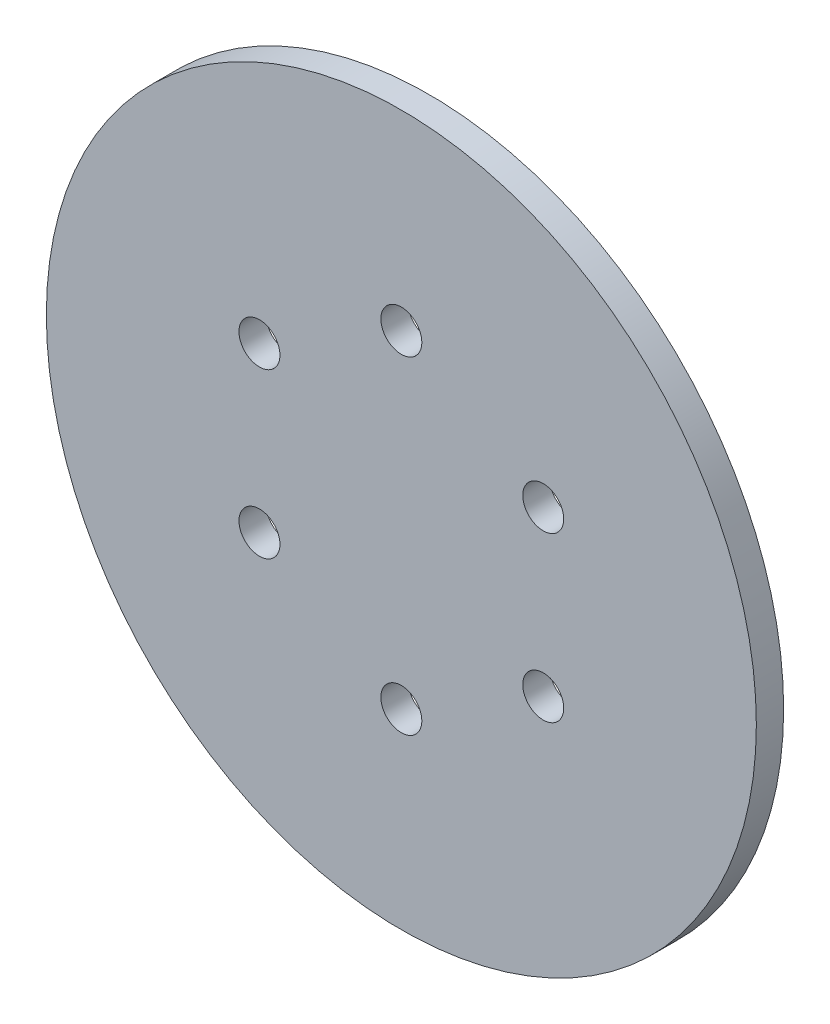
ISO-10303-21;
HEADER;
FILE_DESCRIPTION(('STEP AP214'),'2;1');
FILE_NAME('part.step','',(''),(''),'','','');
FILE_SCHEMA(('AUTOMOTIVE_DESIGN { 1 0 10303 214 1 1 1 1 }'));
ENDSEC;
DATA;
#1=APPLICATION_CONTEXT('core data for automotive mechanical design processes');
#2=APPLICATION_PROTOCOL_DEFINITION('international standard','automotive_design',2000,#1);
#3=PRODUCT_CONTEXT('',#1,'mechanical');
#4=PRODUCT('Part','Part','',(#3));
#5=PRODUCT_RELATED_PRODUCT_CATEGORY('part','',(#4));
#6=PRODUCT_DEFINITION_FORMATION('','',#4);
#7=PRODUCT_DEFINITION_CONTEXT('part definition',#1,'design');
#8=PRODUCT_DEFINITION('design','',#6,#7);
#9=PRODUCT_DEFINITION_SHAPE('','',#8);
#10=(LENGTH_UNIT() NAMED_UNIT(*) SI_UNIT(.MILLI.,.METRE.));
#11=(NAMED_UNIT(*) PLANE_ANGLE_UNIT() SI_UNIT($,.RADIAN.));
#12=(NAMED_UNIT(*) SI_UNIT($,.STERADIAN.) SOLID_ANGLE_UNIT());
#13=UNCERTAINTY_MEASURE_WITH_UNIT(LENGTH_MEASURE(1.E-05),#10,'distance_accuracy_value','');
#14=(GEOMETRIC_REPRESENTATION_CONTEXT(3) GLOBAL_UNCERTAINTY_ASSIGNED_CONTEXT((#13)) GLOBAL_UNIT_ASSIGNED_CONTEXT((#10,
#11,#12)) REPRESENTATION_CONTEXT('',''));
#15=CARTESIAN_POINT('',(0.,0.,0.));
#16=DIRECTION('',(0.,0.,1.));
#17=DIRECTION('',(1.,0.,0.));
#18=AXIS2_PLACEMENT_3D('',#15,#16,#17);
#19=CARTESIAN_POINT('',(0.,0.,3.175));
#20=DIRECTION('',(0.,0.,1.));
#21=DIRECTION('',(1.,0.,0.));
#22=AXIS2_PLACEMENT_3D('',#19,#20,#21);
#23=PLANE('',#22);
#24=CARTESIAN_POINT('',(-16.4977839420919,-9.52500000000094,3.175));
#25=DIRECTION('',(0.,0.,1.));
#26=DIRECTION('',(1.,0.,0.));
#27=AXIS2_PLACEMENT_3D('',#24,#25,#26);
#28=CIRCLE('',#27,2.381250000002);
#29=CARTESIAN_POINT('',(-14.1165339420899,-9.52500000000094,3.175));
#30=VERTEX_POINT('',#29);
#31=EDGE_CURVE('E65',#30,#30,#28,.T.);
#32=ORIENTED_EDGE('',*,*,#31,.F.);
#33=EDGE_LOOP('',(#32));
#34=FACE_BOUND('',#33,.T.);
#35=CARTESIAN_POINT('',(16.4977839420952,-9.52499999999906,3.175));
#36=DIRECTION('',(0.,0.,1.));
#37=DIRECTION('',(1.,0.,0.));
#38=AXIS2_PLACEMENT_3D('',#35,#36,#37);
#39=CIRCLE('',#38,2.38125000000136);
#40=CARTESIAN_POINT('',(18.8790339420965,-9.52499999999906,3.175));
#41=VERTEX_POINT('',#40);
#42=EDGE_CURVE('E53',#41,#41,#39,.T.);
#43=ORIENTED_EDGE('',*,*,#42,.F.);
#44=EDGE_LOOP('',(#43));
#45=FACE_BOUND('',#44,.T.);
#46=CARTESIAN_POINT('',(0.,19.05,3.175));
#47=DIRECTION('',(0.,0.,1.));
#48=DIRECTION('',(1.,0.,0.));
#49=AXIS2_PLACEMENT_3D('',#46,#47,#48);
#50=CIRCLE('',#49,2.38125);
#51=CARTESIAN_POINT('',(2.38125,19.05,3.175));
#52=VERTEX_POINT('',#51);
#53=EDGE_CURVE('E42',#52,#52,#50,.T.);
#54=ORIENTED_EDGE('',*,*,#53,.F.);
#55=EDGE_LOOP('',(#54));
#56=FACE_BOUND('',#55,.T.);
#57=CARTESIAN_POINT('',(0.,0.,3.175));
#58=DIRECTION('',(0.,0.,1.));
#59=DIRECTION('',(1.,0.,0.));
#60=AXIS2_PLACEMENT_3D('',#57,#58,#59);
#61=CIRCLE('',#60,41.275);
#62=CARTESIAN_POINT('',(41.275,0.,3.175));
#63=VERTEX_POINT('',#62);
#64=EDGE_CURVE('E10',#63,#63,#61,.T.);
#65=ORIENTED_EDGE('',*,*,#64,.T.);
#66=EDGE_LOOP('',(#65));
#67=FACE_BOUND('',#66,.T.);
#68=CARTESIAN_POINT('',(16.4977839420941,9.52500000000094,3.175));
#69=DIRECTION('',(0.,0.,1.));
#70=DIRECTION('',(1.,0.,0.));
#71=AXIS2_PLACEMENT_3D('',#68,#69,#70);
#72=CIRCLE('',#71,2.38125000000029);
#73=CARTESIAN_POINT('',(18.8790339420944,9.52500000000094,3.175));
#74=VERTEX_POINT('',#73);
#75=EDGE_CURVE('E47',#74,#74,#72,.T.);
#76=ORIENTED_EDGE('',*,*,#75,.F.);
#77=EDGE_LOOP('',(#76));
#78=FACE_BOUND('',#77,.T.);
#79=CARTESIAN_POINT('',(2.16106835429203E-12,-19.05,3.175));
#80=DIRECTION('',(0.,0.,1.));
#81=DIRECTION('',(1.,0.,0.));
#82=AXIS2_PLACEMENT_3D('',#79,#80,#81);
#83=CIRCLE('',#82,2.38125000000219);
#84=CARTESIAN_POINT('',(2.38125000000436,-19.05,3.175));
#85=VERTEX_POINT('',#84);
#86=EDGE_CURVE('E59',#85,#85,#83,.T.);
#87=ORIENTED_EDGE('',*,*,#86,.F.);
#88=EDGE_LOOP('',(#87));
#89=FACE_BOUND('',#88,.T.);
#90=CARTESIAN_POINT('',(-16.497783942093,9.52499999999905,3.175));
#91=DIRECTION('',(0.,0.,1.));
#92=DIRECTION('',(1.,0.,0.));
#93=AXIS2_PLACEMENT_3D('',#90,#91,#92);
#94=CIRCLE('',#93,2.38125000000102);
#95=CARTESIAN_POINT('',(-14.116533942092,9.52499999999905,3.175));
#96=VERTEX_POINT('',#95);
#97=EDGE_CURVE('E71',#96,#96,#94,.T.);
#98=ORIENTED_EDGE('',*,*,#97,.F.);
#99=EDGE_LOOP('',(#98));
#100=FACE_BOUND('',#99,.T.);
#101=ADVANCED_FACE('F31',(#34,#45,#56,#67,#78,#89,#100),#23,.T.);
#102=CARTESIAN_POINT('',(0.,0.,0.));
#103=DIRECTION('',(0.,0.,1.));
#104=DIRECTION('',(1.,0.,0.));
#105=AXIS2_PLACEMENT_3D('',#102,#103,#104);
#106=PLANE('',#105);
#107=CARTESIAN_POINT('',(0.,0.,0.));
#108=DIRECTION('',(0.,0.,1.));
#109=DIRECTION('',(1.,0.,0.));
#110=AXIS2_PLACEMENT_3D('',#107,#108,#109);
#111=CIRCLE('',#110,41.275);
#112=CARTESIAN_POINT('',(41.275,0.,0.));
#113=VERTEX_POINT('',#112);
#114=EDGE_CURVE('E35',#113,#113,#111,.T.);
#115=ORIENTED_EDGE('',*,*,#114,.F.);
#116=EDGE_LOOP('',(#115));
#117=FACE_BOUND('',#116,.T.);
#118=CARTESIAN_POINT('',(0.,19.05,0.));
#119=DIRECTION('',(0.,0.,1.));
#120=DIRECTION('',(1.,0.,0.));
#121=AXIS2_PLACEMENT_3D('',#118,#119,#120);
#122=CIRCLE('',#121,2.38125);
#123=CARTESIAN_POINT('',(2.38125,19.05,0.));
#124=VERTEX_POINT('',#123);
#125=EDGE_CURVE('E44',#124,#124,#122,.T.);
#126=ORIENTED_EDGE('',*,*,#125,.T.);
#127=EDGE_LOOP('',(#126));
#128=FACE_BOUND('',#127,.T.);
#129=CARTESIAN_POINT('',(16.4977839420941,9.52500000000094,0.));
#130=DIRECTION('',(0.,0.,1.));
#131=DIRECTION('',(1.,0.,0.));
#132=AXIS2_PLACEMENT_3D('',#129,#130,#131);
#133=CIRCLE('',#132,2.38125000000029);
#134=CARTESIAN_POINT('',(18.8790339420944,9.52500000000094,0.));
#135=VERTEX_POINT('',#134);
#136=EDGE_CURVE('E50',#135,#135,#133,.T.);
#137=ORIENTED_EDGE('',*,*,#136,.T.);
#138=EDGE_LOOP('',(#137));
#139=FACE_BOUND('',#138,.T.);
#140=CARTESIAN_POINT('',(16.4977839420952,-9.52499999999906,0.));
#141=DIRECTION('',(0.,0.,1.));
#142=DIRECTION('',(1.,0.,0.));
#143=AXIS2_PLACEMENT_3D('',#140,#141,#142);
#144=CIRCLE('',#143,2.38125000000136);
#145=CARTESIAN_POINT('',(18.8790339420965,-9.52499999999906,0.));
#146=VERTEX_POINT('',#145);
#147=EDGE_CURVE('E56',#146,#146,#144,.T.);
#148=ORIENTED_EDGE('',*,*,#147,.T.);
#149=EDGE_LOOP('',(#148));
#150=FACE_BOUND('',#149,.T.);
#151=CARTESIAN_POINT('',(2.16106835429203E-12,-19.05,0.));
#152=DIRECTION('',(0.,0.,1.));
#153=DIRECTION('',(1.,0.,0.));
#154=AXIS2_PLACEMENT_3D('',#151,#152,#153);
#155=CIRCLE('',#154,2.38125000000219);
#156=CARTESIAN_POINT('',(2.38125000000436,-19.05,0.));
#157=VERTEX_POINT('',#156);
#158=EDGE_CURVE('E62',#157,#157,#155,.T.);
#159=ORIENTED_EDGE('',*,*,#158,.T.);
#160=EDGE_LOOP('',(#159));
#161=FACE_BOUND('',#160,.T.);
#162=CARTESIAN_POINT('',(-16.4977839420919,-9.52500000000094,0.));
#163=DIRECTION('',(0.,0.,1.));
#164=DIRECTION('',(1.,0.,0.));
#165=AXIS2_PLACEMENT_3D('',#162,#163,#164);
#166=CIRCLE('',#165,2.381250000002);
#167=CARTESIAN_POINT('',(-14.1165339420899,-9.52500000000094,0.));
#168=VERTEX_POINT('',#167);
#169=EDGE_CURVE('E68',#168,#168,#166,.T.);
#170=ORIENTED_EDGE('',*,*,#169,.T.);
#171=EDGE_LOOP('',(#170));
#172=FACE_BOUND('',#171,.T.);
#173=CARTESIAN_POINT('',(-16.497783942093,9.52499999999905,0.));
#174=DIRECTION('',(0.,0.,1.));
#175=DIRECTION('',(1.,0.,0.));
#176=AXIS2_PLACEMENT_3D('',#173,#174,#175);
#177=CIRCLE('',#176,2.38125000000102);
#178=CARTESIAN_POINT('',(-14.116533942092,9.52499999999905,0.));
#179=VERTEX_POINT('',#178);
#180=EDGE_CURVE('E74',#179,#179,#177,.T.);
#181=ORIENTED_EDGE('',*,*,#180,.T.);
#182=EDGE_LOOP('',(#181));
#183=FACE_BOUND('',#182,.T.);
#184=ADVANCED_FACE('F84',(#117,#128,#139,#150,#161,#172,#183),#106,.F.);
#185=CARTESIAN_POINT('',(0.,0.,3.175));
#186=DIRECTION('',(0.,0.,-1.));
#187=DIRECTION('',(-1.,0.,0.));
#188=AXIS2_PLACEMENT_3D('',#185,#186,#187);
#189=CYLINDRICAL_SURFACE('',#188,41.275);
#190=ORIENTED_EDGE('',*,*,#64,.F.);
#191=EDGE_LOOP('',(#190));
#192=FACE_BOUND('',#191,.T.);
#193=ORIENTED_EDGE('',*,*,#114,.T.);
#194=EDGE_LOOP('',(#193));
#195=FACE_BOUND('',#194,.T.);
#196=ADVANCED_FACE('F33',(#192,#195),#189,.T.);
#197=CARTESIAN_POINT('',(0.,19.05,3.175));
#198=DIRECTION('',(0.,0.,-1.));
#199=DIRECTION('',(-1.,0.,0.));
#200=AXIS2_PLACEMENT_3D('',#197,#198,#199);
#201=CYLINDRICAL_SURFACE('',#200,2.38125);
#202=ORIENTED_EDGE('',*,*,#53,.T.);
#203=EDGE_LOOP('',(#202));
#204=FACE_BOUND('',#203,.T.);
#205=ORIENTED_EDGE('',*,*,#125,.F.);
#206=EDGE_LOOP('',(#205));
#207=FACE_BOUND('',#206,.T.);
#208=ADVANCED_FACE('F94',(#204,#207),#201,.F.);
#209=CARTESIAN_POINT('',(16.4977839420941,9.52500000000094,3.175));
#210=DIRECTION('',(0.,0.,-1.));
#211=DIRECTION('',(-1.,0.,0.));
#212=AXIS2_PLACEMENT_3D('',#209,#210,#211);
#213=CYLINDRICAL_SURFACE('',#212,2.38125000000029);
#214=ORIENTED_EDGE('',*,*,#75,.T.);
#215=EDGE_LOOP('',(#214));
#216=FACE_BOUND('',#215,.T.);
#217=ORIENTED_EDGE('',*,*,#136,.F.);
#218=EDGE_LOOP('',(#217));
#219=FACE_BOUND('',#218,.T.);
#220=ADVANCED_FACE('F97',(#216,#219),#213,.F.);
#221=CARTESIAN_POINT('',(16.4977839420952,-9.52499999999906,3.175));
#222=DIRECTION('',(0.,0.,-1.));
#223=DIRECTION('',(-1.,0.,0.));
#224=AXIS2_PLACEMENT_3D('',#221,#222,#223);
#225=CYLINDRICAL_SURFACE('',#224,2.38125000000136);
#226=ORIENTED_EDGE('',*,*,#42,.T.);
#227=EDGE_LOOP('',(#226));
#228=FACE_BOUND('',#227,.T.);
#229=ORIENTED_EDGE('',*,*,#147,.F.);
#230=EDGE_LOOP('',(#229));
#231=FACE_BOUND('',#230,.T.);
#232=ADVANCED_FACE('F101',(#228,#231),#225,.F.);
#233=CARTESIAN_POINT('',(2.16106835429203E-12,-19.05,3.175));
#234=DIRECTION('',(0.,0.,-1.));
#235=DIRECTION('',(-1.,0.,0.));
#236=AXIS2_PLACEMENT_3D('',#233,#234,#235);
#237=CYLINDRICAL_SURFACE('',#236,2.38125000000219);
#238=ORIENTED_EDGE('',*,*,#86,.T.);
#239=EDGE_LOOP('',(#238));
#240=FACE_BOUND('',#239,.T.);
#241=ORIENTED_EDGE('',*,*,#158,.F.);
#242=EDGE_LOOP('',(#241));
#243=FACE_BOUND('',#242,.T.);
#244=ADVANCED_FACE('F105',(#240,#243),#237,.F.);
#245=CARTESIAN_POINT('',(-16.4977839420919,-9.52500000000094,3.175));
#246=DIRECTION('',(0.,0.,-1.));
#247=DIRECTION('',(-1.,0.,0.));
#248=AXIS2_PLACEMENT_3D('',#245,#246,#247);
#249=CYLINDRICAL_SURFACE('',#248,2.381250000002);
#250=ORIENTED_EDGE('',*,*,#31,.T.);
#251=EDGE_LOOP('',(#250));
#252=FACE_BOUND('',#251,.T.);
#253=ORIENTED_EDGE('',*,*,#169,.F.);
#254=EDGE_LOOP('',(#253));
#255=FACE_BOUND('',#254,.T.);
#256=ADVANCED_FACE('F109',(#252,#255),#249,.F.);
#257=CARTESIAN_POINT('',(-16.497783942093,9.52499999999905,3.175));
#258=DIRECTION('',(0.,0.,-1.));
#259=DIRECTION('',(-1.,0.,0.));
#260=AXIS2_PLACEMENT_3D('',#257,#258,#259);
#261=CYLINDRICAL_SURFACE('',#260,2.38125000000102);
#262=ORIENTED_EDGE('',*,*,#97,.T.);
#263=EDGE_LOOP('',(#262));
#264=FACE_BOUND('',#263,.T.);
#265=ORIENTED_EDGE('',*,*,#180,.F.);
#266=EDGE_LOOP('',(#265));
#267=FACE_BOUND('',#266,.T.);
#268=ADVANCED_FACE('F80',(#264,#267),#261,.F.);
#269=CLOSED_SHELL('',(#101,#184,#196,#208,#220,#232,#244,#256,#268));
#270=MANIFOLD_SOLID_BREP('B2',#269);
#271=ADVANCED_BREP_SHAPE_REPRESENTATION('',(#18,#270),#14);
#272=SHAPE_DEFINITION_REPRESENTATION(#9,#271);
ENDSEC;
END-ISO-10303-21;
